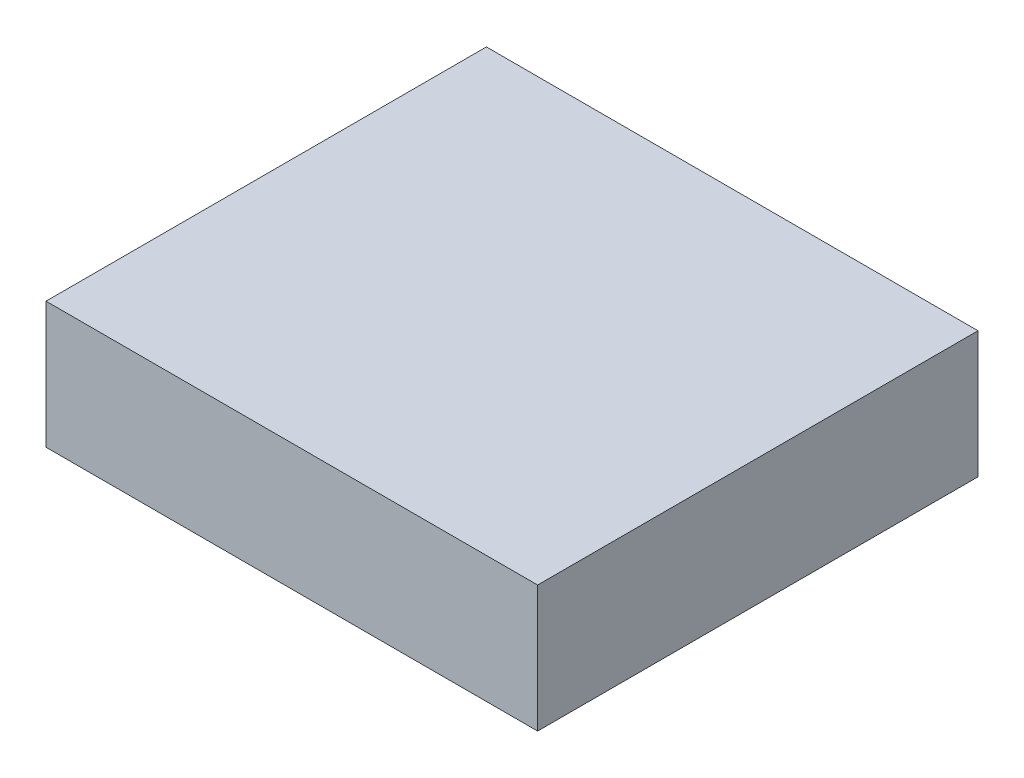
ISO-10303-21;
HEADER;
FILE_DESCRIPTION(('STEP AP214'),'2;1');
FILE_NAME('part.step','',(''),(''),'','','');
FILE_SCHEMA(('AUTOMOTIVE_DESIGN { 1 0 10303 214 1 1 1 1 }'));
ENDSEC;
DATA;
#1=APPLICATION_CONTEXT('core data for automotive mechanical design processes');
#2=APPLICATION_PROTOCOL_DEFINITION('international standard','automotive_design',2000,#1);
#3=PRODUCT_CONTEXT('',#1,'mechanical');
#4=PRODUCT('Part','Part','',(#3));
#5=PRODUCT_RELATED_PRODUCT_CATEGORY('part','',(#4));
#6=PRODUCT_DEFINITION_FORMATION('','',#4);
#7=PRODUCT_DEFINITION_CONTEXT('part definition',#1,'design');
#8=PRODUCT_DEFINITION('design','',#6,#7);
#9=PRODUCT_DEFINITION_SHAPE('','',#8);
#10=(LENGTH_UNIT() NAMED_UNIT(*) SI_UNIT(.MILLI.,.METRE.));
#11=(NAMED_UNIT(*) PLANE_ANGLE_UNIT() SI_UNIT($,.RADIAN.));
#12=(NAMED_UNIT(*) SI_UNIT($,.STERADIAN.) SOLID_ANGLE_UNIT());
#13=UNCERTAINTY_MEASURE_WITH_UNIT(LENGTH_MEASURE(1.E-05),#10,'distance_accuracy_value','');
#14=(GEOMETRIC_REPRESENTATION_CONTEXT(3) GLOBAL_UNCERTAINTY_ASSIGNED_CONTEXT((#13)) GLOBAL_UNIT_ASSIGNED_CONTEXT((#10,
#11,#12)) REPRESENTATION_CONTEXT('',''));
#15=CARTESIAN_POINT('',(0.,0.,0.));
#16=DIRECTION('',(0.,0.,1.));
#17=DIRECTION('',(1.,0.,0.));
#18=AXIS2_PLACEMENT_3D('',#15,#16,#17);
#19=CARTESIAN_POINT('',(0.,20.066,0.));
#20=DIRECTION('',(1.,0.,0.));
#21=DIRECTION('',(0.,0.,-1.));
#22=AXIS2_PLACEMENT_3D('',#19,#20,#21);
#23=PLANE('',#22);
#24=DIRECTION('',(0.,0.,1.));
#25=VECTOR('',#24,1.);
#26=CARTESIAN_POINT('',(0.,0.,0.));
#27=LINE('',#26,#25);
#28=CARTESIAN_POINT('',(0.,0.,-69.85));
#29=VERTEX_POINT('',#28);
#30=CARTESIAN_POINT('',(0.,0.,0.));
#31=VERTEX_POINT('',#30);
#32=EDGE_CURVE('E95',#29,#31,#27,.T.);
#33=ORIENTED_EDGE('',*,*,#32,.T.);
#34=DIRECTION('',(0.,-1.,0.));
#35=VECTOR('',#34,1.);
#36=CARTESIAN_POINT('',(0.,20.066,0.));
#37=LINE('',#36,#35);
#38=CARTESIAN_POINT('',(0.,20.066,0.));
#39=VERTEX_POINT('',#38);
#40=EDGE_CURVE('E11',#39,#31,#37,.T.);
#41=ORIENTED_EDGE('',*,*,#40,.F.);
#42=DIRECTION('',(0.,0.,1.));
#43=VECTOR('',#42,1.);
#44=CARTESIAN_POINT('',(0.,20.066,0.));
#45=LINE('',#44,#43);
#46=CARTESIAN_POINT('',(0.,20.066,-69.85));
#47=VERTEX_POINT('',#46);
#48=EDGE_CURVE('E83',#47,#39,#45,.T.);
#49=ORIENTED_EDGE('',*,*,#48,.F.);
#50=DIRECTION('',(0.,-1.,0.));
#51=VECTOR('',#50,1.);
#52=CARTESIAN_POINT('',(0.,20.066,-69.85));
#53=LINE('',#52,#51);
#54=EDGE_CURVE('E91',#47,#29,#53,.T.);
#55=ORIENTED_EDGE('',*,*,#54,.T.);
#56=EDGE_LOOP('',(#33,#41,#49,#55));
#57=FACE_BOUND('',#56,.T.);
#58=ADVANCED_FACE('F32',(#57),#23,.F.);
#59=CARTESIAN_POINT('',(0.,20.066,0.));
#60=DIRECTION('',(0.,0.,-1.));
#61=DIRECTION('',(-1.,0.,0.));
#62=AXIS2_PLACEMENT_3D('',#59,#60,#61);
#63=PLANE('',#62);
#64=DIRECTION('',(1.,0.,0.));
#65=VECTOR('',#64,1.);
#66=CARTESIAN_POINT('',(0.,0.,0.));
#67=LINE('',#66,#65);
#68=CARTESIAN_POINT('',(77.978,0.,0.));
#69=VERTEX_POINT('',#68);
#70=EDGE_CURVE('E87',#31,#69,#67,.T.);
#71=ORIENTED_EDGE('',*,*,#70,.T.);
#72=DIRECTION('',(0.,-1.,0.));
#73=VECTOR('',#72,1.);
#74=CARTESIAN_POINT('',(77.978,20.066,0.));
#75=LINE('',#74,#73);
#76=CARTESIAN_POINT('',(77.978,20.066,0.));
#77=VERTEX_POINT('',#76);
#78=EDGE_CURVE('E40',#77,#69,#75,.T.);
#79=ORIENTED_EDGE('',*,*,#78,.F.);
#80=DIRECTION('',(1.,0.,0.));
#81=VECTOR('',#80,1.);
#82=CARTESIAN_POINT('',(0.,20.066,0.));
#83=LINE('',#82,#81);
#84=EDGE_CURVE('E78',#39,#77,#83,.T.);
#85=ORIENTED_EDGE('',*,*,#84,.F.);
#86=ORIENTED_EDGE('',*,*,#40,.T.);
#87=EDGE_LOOP('',(#71,#79,#85,#86));
#88=FACE_BOUND('',#87,.T.);
#89=ADVANCED_FACE('F86',(#88),#63,.F.);
#90=CARTESIAN_POINT('',(77.978,20.066,0.));
#91=DIRECTION('',(-1.,0.,0.));
#92=DIRECTION('',(0.,0.,1.));
#93=AXIS2_PLACEMENT_3D('',#90,#91,#92);
#94=PLANE('',#93);
#95=DIRECTION('',(0.,0.,-1.));
#96=VECTOR('',#95,1.);
#97=CARTESIAN_POINT('',(77.978,0.,0.));
#98=LINE('',#97,#96);
#99=CARTESIAN_POINT('',(77.978,0.,-69.85));
#100=VERTEX_POINT('',#99);
#101=EDGE_CURVE('E65',#69,#100,#98,.T.);
#102=ORIENTED_EDGE('',*,*,#101,.T.);
#103=DIRECTION('',(0.,-1.,0.));
#104=VECTOR('',#103,1.);
#105=CARTESIAN_POINT('',(77.978,20.066,-69.85));
#106=LINE('',#105,#104);
#107=CARTESIAN_POINT('',(77.978,20.066,-69.85));
#108=VERTEX_POINT('',#107);
#109=EDGE_CURVE('E88',#108,#100,#106,.T.);
#110=ORIENTED_EDGE('',*,*,#109,.F.);
#111=DIRECTION('',(0.,0.,-1.));
#112=VECTOR('',#111,1.);
#113=CARTESIAN_POINT('',(77.978,20.066,0.));
#114=LINE('',#113,#112);
#115=EDGE_CURVE('E81',#77,#108,#114,.T.);
#116=ORIENTED_EDGE('',*,*,#115,.F.);
#117=ORIENTED_EDGE('',*,*,#78,.T.);
#118=EDGE_LOOP('',(#102,#110,#116,#117));
#119=FACE_BOUND('',#118,.T.);
#120=ADVANCED_FACE('F89',(#119),#94,.F.);
#121=CARTESIAN_POINT('',(0.,20.066,-69.85));
#122=DIRECTION('',(0.,0.,1.));
#123=DIRECTION('',(1.,0.,0.));
#124=AXIS2_PLACEMENT_3D('',#121,#122,#123);
#125=PLANE('',#124);
#126=DIRECTION('',(-1.,0.,0.));
#127=VECTOR('',#126,1.);
#128=CARTESIAN_POINT('',(0.,0.,-69.85));
#129=LINE('',#128,#127);
#130=EDGE_CURVE('E71',#100,#29,#129,.T.);
#131=ORIENTED_EDGE('',*,*,#130,.T.);
#132=ORIENTED_EDGE('',*,*,#54,.F.);
#133=DIRECTION('',(-1.,0.,0.));
#134=VECTOR('',#133,1.);
#135=CARTESIAN_POINT('',(0.,20.066,-69.85));
#136=LINE('',#135,#134);
#137=EDGE_CURVE('E48',#108,#47,#136,.T.);
#138=ORIENTED_EDGE('',*,*,#137,.F.);
#139=ORIENTED_EDGE('',*,*,#109,.T.);
#140=EDGE_LOOP('',(#131,#132,#138,#139));
#141=FACE_BOUND('',#140,.T.);
#142=ADVANCED_FACE('F102',(#141),#125,.F.);
#143=CARTESIAN_POINT('',(0.,20.066,-69.85));
#144=DIRECTION('',(0.,-1.,0.));
#145=DIRECTION('',(0.,0.,-1.));
#146=AXIS2_PLACEMENT_3D('',#143,#144,#145);
#147=PLANE('',#146);
#148=ORIENTED_EDGE('',*,*,#48,.T.);
#149=ORIENTED_EDGE('',*,*,#84,.T.);
#150=ORIENTED_EDGE('',*,*,#115,.T.);
#151=ORIENTED_EDGE('',*,*,#137,.T.);
#152=EDGE_LOOP('',(#148,#149,#150,#151));
#153=FACE_BOUND('',#152,.T.);
#154=ADVANCED_FACE('F79',(#153),#147,.F.);
#155=CARTESIAN_POINT('',(0.,0.,-69.85));
#156=DIRECTION('',(0.,-1.,0.));
#157=DIRECTION('',(0.,0.,-1.));
#158=AXIS2_PLACEMENT_3D('',#155,#156,#157);
#159=PLANE('',#158);
#160=ORIENTED_EDGE('',*,*,#32,.F.);
#161=ORIENTED_EDGE('',*,*,#130,.F.);
#162=ORIENTED_EDGE('',*,*,#101,.F.);
#163=ORIENTED_EDGE('',*,*,#70,.F.);
#164=EDGE_LOOP('',(#160,#161,#162,#163));
#165=FACE_BOUND('',#164,.T.);
#166=ADVANCED_FACE('F105',(#165),#159,.T.);
#167=CLOSED_SHELL('',(#58,#89,#120,#142,#154,#166));
#168=MANIFOLD_SOLID_BREP('B2',#167);
#169=ADVANCED_BREP_SHAPE_REPRESENTATION('',(#18,#168),#14);
#170=SHAPE_DEFINITION_REPRESENTATION(#9,#169);
ENDSEC;
END-ISO-10303-21;
